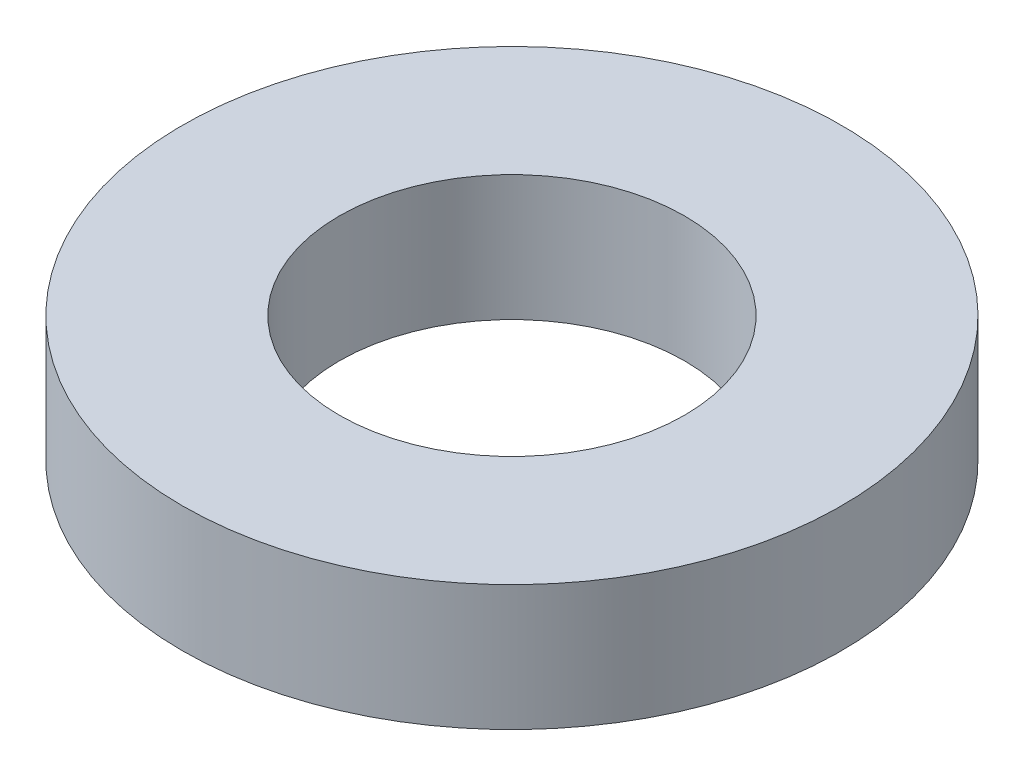
ISO-10303-21;
HEADER;
FILE_DESCRIPTION(('STEP AP214'),'2;1');
FILE_NAME('part.step','',(''),(''),'','','');
FILE_SCHEMA(('AUTOMOTIVE_DESIGN { 1 0 10303 214 1 1 1 1 }'));
ENDSEC;
DATA;
#1=APPLICATION_CONTEXT('core data for automotive mechanical design processes');
#2=APPLICATION_PROTOCOL_DEFINITION('international standard','automotive_design',2000,#1);
#3=PRODUCT_CONTEXT('',#1,'mechanical');
#4=PRODUCT('Part','Part','',(#3));
#5=PRODUCT_RELATED_PRODUCT_CATEGORY('part','',(#4));
#6=PRODUCT_DEFINITION_FORMATION('','',#4);
#7=PRODUCT_DEFINITION_CONTEXT('part definition',#1,'design');
#8=PRODUCT_DEFINITION('design','',#6,#7);
#9=PRODUCT_DEFINITION_SHAPE('','',#8);
#10=(LENGTH_UNIT() NAMED_UNIT(*) SI_UNIT(.MILLI.,.METRE.));
#11=(NAMED_UNIT(*) PLANE_ANGLE_UNIT() SI_UNIT($,.RADIAN.));
#12=(NAMED_UNIT(*) SI_UNIT($,.STERADIAN.) SOLID_ANGLE_UNIT());
#13=UNCERTAINTY_MEASURE_WITH_UNIT(LENGTH_MEASURE(1.E-05),#10,'distance_accuracy_value','');
#14=(GEOMETRIC_REPRESENTATION_CONTEXT(3) GLOBAL_UNCERTAINTY_ASSIGNED_CONTEXT((#13)) GLOBAL_UNIT_ASSIGNED_CONTEXT((#10,
#11,#12)) REPRESENTATION_CONTEXT('',''));
#15=CARTESIAN_POINT('',(0.,0.,0.));
#16=DIRECTION('',(0.,0.,1.));
#17=DIRECTION('',(1.,0.,0.));
#18=AXIS2_PLACEMENT_3D('',#15,#16,#17);
#19=CARTESIAN_POINT('',(0.,1.2,0.));
#20=DIRECTION('',(0.,1.,0.));
#21=DIRECTION('',(0.,0.,1.));
#22=AXIS2_PLACEMENT_3D('',#19,#20,#21);
#23=PLANE('',#22);
#24=CARTESIAN_POINT('',(0.,1.2,0.));
#25=DIRECTION('',(0.,1.,0.));
#26=DIRECTION('',(0.,0.,1.));
#27=AXIS2_PLACEMENT_3D('',#24,#25,#26);
#28=CIRCLE('',#27,3.15);
#29=CARTESIAN_POINT('',(0.,1.2,3.15));
#30=VERTEX_POINT('',#29);
#31=EDGE_CURVE('E10',#30,#30,#28,.T.);
#32=ORIENTED_EDGE('',*,*,#31,.T.);
#33=EDGE_LOOP('',(#32));
#34=FACE_BOUND('',#33,.T.);
#35=CARTESIAN_POINT('',(0.,1.2,0.));
#36=DIRECTION('',(0.,1.,0.));
#37=DIRECTION('',(0.,0.,1.));
#38=AXIS2_PLACEMENT_3D('',#35,#36,#37);
#39=CIRCLE('',#38,1.65);
#40=CARTESIAN_POINT('',(0.,1.2,1.65));
#41=VERTEX_POINT('',#40);
#42=EDGE_CURVE('E42',#41,#41,#39,.T.);
#43=ORIENTED_EDGE('',*,*,#42,.F.);
#44=EDGE_LOOP('',(#43));
#45=FACE_BOUND('',#44,.T.);
#46=ADVANCED_FACE('F31',(#34,#45),#23,.T.);
#47=CARTESIAN_POINT('',(0.,0.,0.));
#48=DIRECTION('',(0.,1.,0.));
#49=DIRECTION('',(0.,0.,1.));
#50=AXIS2_PLACEMENT_3D('',#47,#48,#49);
#51=PLANE('',#50);
#52=CARTESIAN_POINT('',(0.,0.,0.));
#53=DIRECTION('',(0.,1.,0.));
#54=DIRECTION('',(0.,0.,1.));
#55=AXIS2_PLACEMENT_3D('',#52,#53,#54);
#56=CIRCLE('',#55,3.15);
#57=CARTESIAN_POINT('',(0.,0.,3.15));
#58=VERTEX_POINT('',#57);
#59=EDGE_CURVE('E35',#58,#58,#56,.T.);
#60=ORIENTED_EDGE('',*,*,#59,.F.);
#61=EDGE_LOOP('',(#60));
#62=FACE_BOUND('',#61,.T.);
#63=CARTESIAN_POINT('',(0.,0.,0.));
#64=DIRECTION('',(0.,1.,0.));
#65=DIRECTION('',(0.,0.,1.));
#66=AXIS2_PLACEMENT_3D('',#63,#64,#65);
#67=CIRCLE('',#66,1.65);
#68=CARTESIAN_POINT('',(0.,0.,1.65));
#69=VERTEX_POINT('',#68);
#70=EDGE_CURVE('E44',#69,#69,#67,.T.);
#71=ORIENTED_EDGE('',*,*,#70,.T.);
#72=EDGE_LOOP('',(#71));
#73=FACE_BOUND('',#72,.T.);
#74=ADVANCED_FACE('F54',(#62,#73),#51,.F.);
#75=CARTESIAN_POINT('',(0.,1.2,0.));
#76=DIRECTION('',(0.,-1.,0.));
#77=DIRECTION('',(0.,0.,-1.));
#78=AXIS2_PLACEMENT_3D('',#75,#76,#77);
#79=CYLINDRICAL_SURFACE('',#78,3.15);
#80=ORIENTED_EDGE('',*,*,#31,.F.);
#81=EDGE_LOOP('',(#80));
#82=FACE_BOUND('',#81,.T.);
#83=ORIENTED_EDGE('',*,*,#59,.T.);
#84=EDGE_LOOP('',(#83));
#85=FACE_BOUND('',#84,.T.);
#86=ADVANCED_FACE('F33',(#82,#85),#79,.T.);
#87=CARTESIAN_POINT('',(0.,1.2,0.));
#88=DIRECTION('',(0.,-1.,0.));
#89=DIRECTION('',(0.,0.,-1.));
#90=AXIS2_PLACEMENT_3D('',#87,#88,#89);
#91=CYLINDRICAL_SURFACE('',#90,1.65);
#92=ORIENTED_EDGE('',*,*,#42,.T.);
#93=EDGE_LOOP('',(#92));
#94=FACE_BOUND('',#93,.T.);
#95=ORIENTED_EDGE('',*,*,#70,.F.);
#96=EDGE_LOOP('',(#95));
#97=FACE_BOUND('',#96,.T.);
#98=ADVANCED_FACE('F50',(#94,#97),#91,.F.);
#99=CLOSED_SHELL('',(#46,#74,#86,#98));
#100=MANIFOLD_SOLID_BREP('B2',#99);
#101=ADVANCED_BREP_SHAPE_REPRESENTATION('',(#18,#100),#14);
#102=SHAPE_DEFINITION_REPRESENTATION(#9,#101);
ENDSEC;
END-ISO-10303-21;
